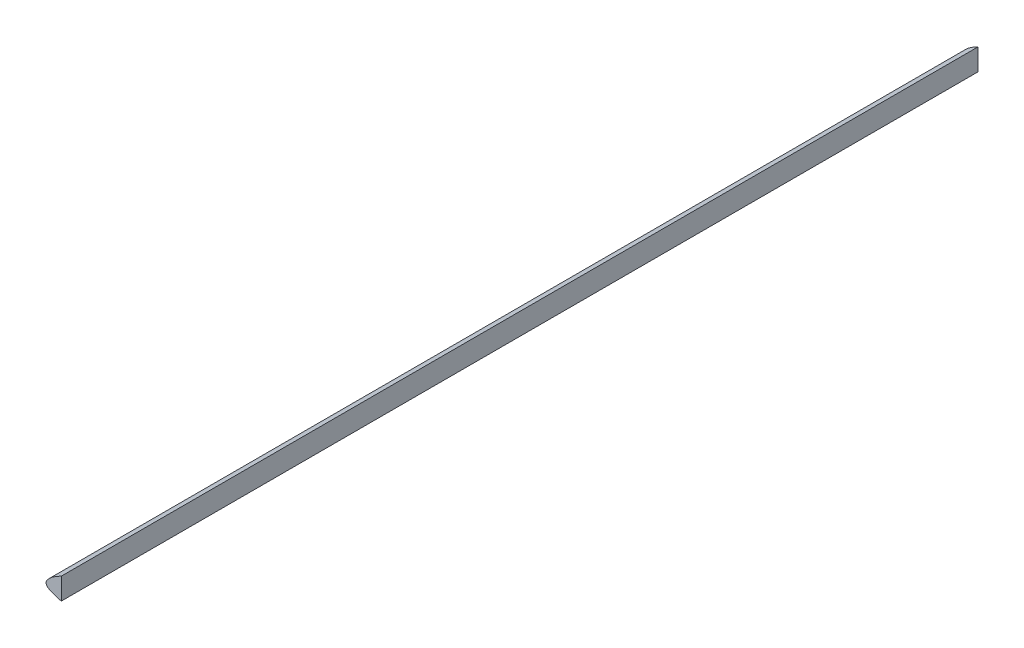
ISO-10303-21;
HEADER;
FILE_DESCRIPTION(('STEP AP214'),'2;1');
FILE_NAME('part.step','',(''),(''),'','','');
FILE_SCHEMA(('AUTOMOTIVE_DESIGN { 1 0 10303 214 1 1 1 1 }'));
ENDSEC;
DATA;
#1=APPLICATION_CONTEXT('core data for automotive mechanical design processes');
#2=APPLICATION_PROTOCOL_DEFINITION('international standard','automotive_design',2000,#1);
#3=PRODUCT_CONTEXT('',#1,'mechanical');
#4=PRODUCT('Part','Part','',(#3));
#5=PRODUCT_RELATED_PRODUCT_CATEGORY('part','',(#4));
#6=PRODUCT_DEFINITION_FORMATION('','',#4);
#7=PRODUCT_DEFINITION_CONTEXT('part definition',#1,'design');
#8=PRODUCT_DEFINITION('design','',#6,#7);
#9=PRODUCT_DEFINITION_SHAPE('','',#8);
#10=(LENGTH_UNIT() NAMED_UNIT(*) SI_UNIT(.MILLI.,.METRE.));
#11=(NAMED_UNIT(*) PLANE_ANGLE_UNIT() SI_UNIT($,.RADIAN.));
#12=(NAMED_UNIT(*) SI_UNIT($,.STERADIAN.) SOLID_ANGLE_UNIT());
#13=UNCERTAINTY_MEASURE_WITH_UNIT(LENGTH_MEASURE(1.E-05),#10,'distance_accuracy_value','');
#14=(GEOMETRIC_REPRESENTATION_CONTEXT(3) GLOBAL_UNCERTAINTY_ASSIGNED_CONTEXT((#13)) GLOBAL_UNIT_ASSIGNED_CONTEXT((#10,
#11,#12)) REPRESENTATION_CONTEXT('',''));
#15=CARTESIAN_POINT('',(0.,0.,0.));
#16=DIRECTION('',(0.,0.,1.));
#17=DIRECTION('',(1.,0.,0.));
#18=AXIS2_PLACEMENT_3D('',#15,#16,#17);
#19=CARTESIAN_POINT('',(1.15165455923713,2.60088125935629,-761.999746));
#20=DIRECTION('',(0.,0.,-1.));
#21=DIRECTION('',(-1.,0.,0.));
#22=AXIS2_PLACEMENT_3D('',#19,#20,#21);
#23=PLANE('',#22);
#24=DIRECTION('',(0.,-1.,0.));
#25=VECTOR('',#24,1.);
#26=CARTESIAN_POINT('',(12.7000000000001,0.,-761.999746));
#27=LINE('',#26,#25);
#28=CARTESIAN_POINT('',(12.7000000000001,11.1170877286177,-761.999746));
#29=VERTEX_POINT('',#28);
#30=CARTESIAN_POINT('',(12.7000000000001,-6.87603561469755,-761.999746));
#31=VERTEX_POINT('',#30);
#32=EDGE_CURVE('E62',#29,#31,#27,.T.);
#33=ORIENTED_EDGE('',*,*,#32,.T.);
#34=CARTESIAN_POINT('',(324.9026935512,0.,-761.999746));
#35=CARTESIAN_POINT('',(324.90346319559,0.0233133583806574,-761.999746));
#36=CARTESIAN_POINT('',(322.493960124611,0.266874853266928,-761.999746));
#37=CARTESIAN_POINT('',(320.107118726271,0.728898481684864,-761.999746));
#38=CARTESIAN_POINT('',(314.479929879271,1.69659954466814,-761.999746));
#39=CARTESIAN_POINT('',(307.761979309178,2.96651084650256,-761.999746));
#40=CARTESIAN_POINT('',(299.156213965818,4.44402058990994,-761.999746));
#41=CARTESIAN_POINT('',(289.108994082194,6.05458721176259,-761.999746));
#42=CARTESIAN_POINT('',(277.614504556848,7.85862541822672,-761.999746));
#43=CARTESIAN_POINT('',(264.867967681756,9.82863928319501,-761.999746));
#44=CARTESIAN_POINT('',(251.037893607433,11.9464568649147,-761.999746));
#45=CARTESIAN_POINT('',(236.320520328163,14.1628286822193,-761.999746));
#46=CARTESIAN_POINT('',(220.915494029042,16.4347978422618,-761.999746));
#47=CARTESIAN_POINT('',(205.033677241231,18.7162921045369,-761.999746));
#48=CARTESIAN_POINT('',(188.883341886899,20.9229885970704,-761.999746));
#49=CARTESIAN_POINT('',(172.682407247215,22.9973105242966,-761.999746));
#50=CARTESIAN_POINT('',(156.622614564687,24.8301784866328,-761.999746));
#51=CARTESIAN_POINT('',(140.85040765116,26.2625796247527,-761.999746));
#52=CARTESIAN_POINT('',(125.478771127742,27.2050458448488,-761.999746));
#53=CARTESIAN_POINT('',(110.596641231566,27.6094132257854,-761.999746));
#54=CARTESIAN_POINT('',(96.2853033385808,27.4446531652477,-761.999746));
#55=CARTESIAN_POINT('',(82.6164523566715,26.7221772489685,-761.999746));
#56=CARTESIAN_POINT('',(69.6684349637199,25.4642524848224,-761.999746));
#57=CARTESIAN_POINT('',(57.5288522663284,23.7890753252532,-761.999746));
#58=CARTESIAN_POINT('',(46.3056688527853,21.7557737945352,-761.999746));
#59=CARTESIAN_POINT('',(36.1124988210342,19.421560606896,-761.999746));
#60=CARTESIAN_POINT('',(27.0454876777921,16.8469786053261,-761.999746));
#61=CARTESIAN_POINT('',(19.1969550247217,14.0824194665185,-761.999746));
#62=CARTESIAN_POINT('',(12.6195182535387,11.1953401492948,-761.999746));
#63=CARTESIAN_POINT('',(7.39382924872228,8.27357700541017,-761.999746));
#64=CARTESIAN_POINT('',(3.46645559888262,5.36260960395899,-761.999746));
#65=CARTESIAN_POINT('',(1.0721441800177,2.69745028336921,-761.999746));
#66=CARTESIAN_POINT('',(-0.44301831227786,-0.0163803086251834,-761.999746));
#67=CARTESIAN_POINT('',(1.14212328936869,-2.66038157127671,-761.999746));
#68=CARTESIAN_POINT('',(4.36503605971503,-4.22676457114381,-761.999746));
#69=CARTESIAN_POINT('',(8.97122140423381,-6.02880941856467,-761.999746));
#70=CARTESIAN_POINT('',(15.243598773671,-7.49562746974023,-761.999746));
#71=CARTESIAN_POINT('',(23.0320560801708,-8.81343307785173,-761.999746));
#72=CARTESIAN_POINT('',(32.3248291039904,-9.88501521121111,-761.999746));
#73=CARTESIAN_POINT('',(43.02561085123,-10.7220049250572,-761.999746));
#74=CARTESIAN_POINT('',(55.0370190293927,-11.3213307402037,-761.999746));
#75=CARTESIAN_POINT('',(68.2344021608391,-11.6831205739109,-761.999746));
#76=CARTESIAN_POINT('',(82.4768909373014,-11.8216946355356,-761.999746));
#77=CARTESIAN_POINT('',(97.6058535702517,-11.7312635564645,-761.999746));
#78=CARTESIAN_POINT('',(113.468681032216,-11.4146303668036,-761.999746));
#79=CARTESIAN_POINT('',(129.930020512529,-10.7984705199419,-761.999746));
#80=CARTESIAN_POINT('',(146.859715046732,-9.93880113727659,-761.999746));
#81=CARTESIAN_POINT('',(164.102555427845,-8.95468862894909,-761.999746));
#82=CARTESIAN_POINT('',(181.455347717627,-7.91418790276717,-761.999746));
#83=CARTESIAN_POINT('',(198.694582838916,-6.86098310953203,-761.999746));
#84=CARTESIAN_POINT('',(215.596359860735,-5.83696040869958,-761.999746));
#85=CARTESIAN_POINT('',(231.942646986744,-4.86345762457903,-761.999746));
#86=CARTESIAN_POINT('',(247.517899408465,-3.96716262112094,-761.999746));
#87=CARTESIAN_POINT('',(262.118380872368,-3.15712058268027,-761.999746));
#88=CARTESIAN_POINT('',(275.542852028211,-2.44567542809517,-761.999746));
#89=CARTESIAN_POINT('',(287.622696903447,-1.83567813821833,-761.999746));
#90=CARTESIAN_POINT('',(298.158964312839,-1.30681197821665,-761.999746));
#91=CARTESIAN_POINT('',(307.165416690346,-0.826816663963498,-761.999746));
#92=CARTESIAN_POINT('',(314.173983408068,-0.368946974828929,-761.999746));
#93=CARTESIAN_POINT('',(319.999788969716,-0.117218531002151,-761.999746));
#94=CARTESIAN_POINT('',(322.456899939764,0.0391125120748008,-761.999746));
#95=CARTESIAN_POINT('',(324.901921434116,-0.0233882589368036,-761.999746));
#96=CARTESIAN_POINT('',(324.9026935512,0.,-761.999746));
#97=B_SPLINE_CURVE_WITH_KNOTS('',3,(#34,#35,#36,#37,#38,#39,#40,#41,#42,#43,#44,#45,#46,#47,#48,
#49,#50,#51,#52,#53,#54,#55,#56,#57,#58,#59,#60,#61,#62,#63,#64,#65,#66,#67,#68,#69,#70,#71,#72,
#73,#74,#75,#76,#77,#78,#79,#80,#81,#82,#83,#84,#85,#86,#87,#88,#89,#90,#91,#92,#93,#94,#95,
#96),.UNSPECIFIED.,.T.,.F.,(4,1,1,1,1,1,1,1,1,1,1,1,1,1,1,1,1,1,1,1,1,1,1,1,1,1,1,1,1,1,1,1,1,1,
1,1,1,1,1,1,1,1,1,1,1,1,1,1,1,1,1,1,1,1,1,1,1,1,1,1,4),(0.,0.00174808161666409,
0.00682736461152588,0.0148802194660928,0.0255723245187996,0.0386941569613535,0.0541707804092893,
0.0718340915004338,0.0914345327939838,0.112684613523076,0.135293128889252,0.158943981406575,
0.183314993013972,0.208069947428828,0.232879415911381,0.257398767385958,0.28138363259568,
0.304705763006072,0.32724149700788,0.348896563368039,0.369606939586334,0.389308375744097,
0.407885695760754,0.425177148613117,0.441026789913431,0.455299971521906,0.467903884546168,
0.478751648141021,0.487814349118281,0.495090030563699,0.500616983015744,0.504451368015862,
0.507803776366331,0.513091193317012,0.52054622904494,0.530249123140569,0.542213645081559,
0.556382479077403,0.572655501749116,0.590894528635496,0.610925387189739,0.632535858974259,
0.655496365431996,0.679547083246405,0.704498568619219,0.730211424578536,0.756435524546716,
0.782836661122501,0.809062449565475,0.834775916464845,0.859641281327499,0.883337826525987,
0.905540839068826,0.925965138816007,0.944326312756837,0.960365876879218,0.973929437555459,
0.984907697461011,0.993111340436855,0.998246302191831,1.),.UNSPECIFIED.);
#98=EDGE_CURVE('E11',#29,#31,#97,.T.);
#99=ORIENTED_EDGE('',*,*,#98,.F.);
#100=EDGE_LOOP('',(#33,#99));
#101=FACE_BOUND('',#100,.T.);
#102=ADVANCED_FACE('F33',(#101),#23,.T.);
#103=CARTESIAN_POINT('',(1.15165455923713,2.60088125935629,0.));
#104=DIRECTION('',(0.,0.,-1.));
#105=DIRECTION('',(-1.,0.,0.));
#106=AXIS2_PLACEMENT_3D('',#103,#104,#105);
#107=PLANE('',#106);
#108=CARTESIAN_POINT('',(324.9026935512,0.,0.));
#109=CARTESIAN_POINT('',(324.90346319559,0.0233133583806574,0.));
#110=CARTESIAN_POINT('',(322.493960124611,0.266874853266928,0.));
#111=CARTESIAN_POINT('',(320.107118726271,0.728898481684864,0.));
#112=CARTESIAN_POINT('',(314.479929879271,1.69659954466814,0.));
#113=CARTESIAN_POINT('',(307.761979309178,2.96651084650256,0.));
#114=CARTESIAN_POINT('',(299.156213965818,4.44402058990994,0.));
#115=CARTESIAN_POINT('',(289.108994082194,6.05458721176259,0.));
#116=CARTESIAN_POINT('',(277.614504556848,7.85862541822672,0.));
#117=CARTESIAN_POINT('',(264.867967681756,9.82863928319501,0.));
#118=CARTESIAN_POINT('',(251.037893607433,11.9464568649147,0.));
#119=CARTESIAN_POINT('',(236.320520328163,14.1628286822193,0.));
#120=CARTESIAN_POINT('',(220.915494029042,16.4347978422618,0.));
#121=CARTESIAN_POINT('',(205.033677241231,18.7162921045369,0.));
#122=CARTESIAN_POINT('',(188.883341886899,20.9229885970704,0.));
#123=CARTESIAN_POINT('',(172.682407247215,22.9973105242966,0.));
#124=CARTESIAN_POINT('',(156.622614564687,24.8301784866328,0.));
#125=CARTESIAN_POINT('',(140.85040765116,26.2625796247527,0.));
#126=CARTESIAN_POINT('',(125.478771127742,27.2050458448488,0.));
#127=CARTESIAN_POINT('',(110.596641231566,27.6094132257854,0.));
#128=CARTESIAN_POINT('',(96.2853033385808,27.4446531652477,0.));
#129=CARTESIAN_POINT('',(82.6164523566715,26.7221772489685,0.));
#130=CARTESIAN_POINT('',(69.6684349637199,25.4642524848224,0.));
#131=CARTESIAN_POINT('',(57.5288522663284,23.7890753252532,0.));
#132=CARTESIAN_POINT('',(46.3056688527853,21.7557737945352,0.));
#133=CARTESIAN_POINT('',(36.1124988210342,19.421560606896,0.));
#134=CARTESIAN_POINT('',(27.0454876777921,16.8469786053261,0.));
#135=CARTESIAN_POINT('',(19.1969550247217,14.0824194665185,0.));
#136=CARTESIAN_POINT('',(12.6195182535387,11.1953401492948,0.));
#137=CARTESIAN_POINT('',(7.39382924872228,8.27357700541017,0.));
#138=CARTESIAN_POINT('',(3.46645559888262,5.36260960395899,0.));
#139=CARTESIAN_POINT('',(1.0721441800177,2.69745028336921,0.));
#140=CARTESIAN_POINT('',(-0.44301831227786,-0.0163803086251834,0.));
#141=CARTESIAN_POINT('',(1.14212328936869,-2.66038157127671,0.));
#142=CARTESIAN_POINT('',(4.36503605971503,-4.22676457114381,0.));
#143=CARTESIAN_POINT('',(8.97122140423381,-6.02880941856467,0.));
#144=CARTESIAN_POINT('',(15.243598773671,-7.49562746974023,0.));
#145=CARTESIAN_POINT('',(23.0320560801708,-8.81343307785173,0.));
#146=CARTESIAN_POINT('',(32.3248291039904,-9.88501521121111,0.));
#147=CARTESIAN_POINT('',(43.02561085123,-10.7220049250572,0.));
#148=CARTESIAN_POINT('',(55.0370190293927,-11.3213307402037,0.));
#149=CARTESIAN_POINT('',(68.2344021608391,-11.6831205739109,0.));
#150=CARTESIAN_POINT('',(82.4768909373014,-11.8216946355356,0.));
#151=CARTESIAN_POINT('',(97.6058535702517,-11.7312635564645,0.));
#152=CARTESIAN_POINT('',(113.468681032216,-11.4146303668036,0.));
#153=CARTESIAN_POINT('',(129.930020512529,-10.7984705199419,0.));
#154=CARTESIAN_POINT('',(146.859715046732,-9.93880113727659,0.));
#155=CARTESIAN_POINT('',(164.102555427845,-8.95468862894909,0.));
#156=CARTESIAN_POINT('',(181.455347717627,-7.91418790276717,0.));
#157=CARTESIAN_POINT('',(198.694582838916,-6.86098310953203,0.));
#158=CARTESIAN_POINT('',(215.596359860735,-5.83696040869958,0.));
#159=CARTESIAN_POINT('',(231.942646986744,-4.86345762457903,0.));
#160=CARTESIAN_POINT('',(247.517899408465,-3.96716262112094,0.));
#161=CARTESIAN_POINT('',(262.118380872368,-3.15712058268027,0.));
#162=CARTESIAN_POINT('',(275.542852028211,-2.44567542809517,0.));
#163=CARTESIAN_POINT('',(287.622696903447,-1.83567813821833,0.));
#164=CARTESIAN_POINT('',(298.158964312839,-1.30681197821665,0.));
#165=CARTESIAN_POINT('',(307.165416690346,-0.826816663963498,0.));
#166=CARTESIAN_POINT('',(314.173983408068,-0.368946974828929,0.));
#167=CARTESIAN_POINT('',(319.999788969716,-0.117218531002151,0.));
#168=CARTESIAN_POINT('',(322.456899939764,0.0391125120748008,0.));
#169=CARTESIAN_POINT('',(324.901921434116,-0.0233882589368036,0.));
#170=CARTESIAN_POINT('',(324.9026935512,0.,0.));
#171=B_SPLINE_CURVE_WITH_KNOTS('',3,(#108,#109,#110,#111,#112,#113,#114,#115,#116,#117,#118,
#119,#120,#121,#122,#123,#124,#125,#126,#127,#128,#129,#130,#131,#132,#133,#134,#135,#136,#137,
#138,#139,#140,#141,#142,#143,#144,#145,#146,#147,#148,#149,#150,#151,#152,#153,#154,#155,#156,
#157,#158,#159,#160,#161,#162,#163,#164,#165,#166,#167,#168,#169,#170),.UNSPECIFIED.,.T.,.F.,(4,
1,1,1,1,1,1,1,1,1,1,1,1,1,1,1,1,1,1,1,1,1,1,1,1,1,1,1,1,1,1,1,1,1,1,1,1,1,1,1,1,1,1,1,1,1,1,1,1,
1,1,1,1,1,1,1,1,1,1,1,4),(0.,0.00174808161666409,0.00682736461152588,0.0148802194660928,
0.0255723245187996,0.0386941569613535,0.0541707804092893,0.0718340915004338,0.0914345327939838,
0.112684613523076,0.135293128889252,0.158943981406575,0.183314993013972,0.208069947428828,
0.232879415911381,0.257398767385958,0.28138363259568,0.304705763006072,0.32724149700788,
0.348896563368039,0.369606939586334,0.389308375744097,0.407885695760754,0.425177148613117,
0.441026789913431,0.455299971521906,0.467903884546168,0.478751648141021,0.487814349118281,
0.495090030563699,0.500616983015744,0.504451368015862,0.507803776366331,0.513091193317012,
0.52054622904494,0.530249123140569,0.542213645081559,0.556382479077403,0.572655501749116,
0.590894528635496,0.610925387189739,0.632535858974259,0.655496365431996,0.679547083246405,
0.704498568619219,0.730211424578536,0.756435524546716,0.782836661122501,0.809062449565475,
0.834775916464845,0.859641281327499,0.883337826525987,0.905540839068826,0.925965138816007,
0.944326312756837,0.960365876879218,0.973929437555459,0.984907697461011,0.993111340436855,
0.998246302191831,1.),.UNSPECIFIED.);
#172=CARTESIAN_POINT('',(12.7000000000001,11.1170877286177,0.));
#173=VERTEX_POINT('',#172);
#174=CARTESIAN_POINT('',(12.7000000000001,-6.87603561469755,0.));
#175=VERTEX_POINT('',#174);
#176=EDGE_CURVE('E43',#173,#175,#171,.T.);
#177=ORIENTED_EDGE('',*,*,#176,.T.);
#178=DIRECTION('',(0.,-1.,0.));
#179=VECTOR('',#178,1.);
#180=CARTESIAN_POINT('',(12.7000000000001,0.,0.));
#181=LINE('',#180,#179);
#182=EDGE_CURVE('E50',#173,#175,#181,.T.);
#183=ORIENTED_EDGE('',*,*,#182,.F.);
#184=EDGE_LOOP('',(#177,#183));
#185=FACE_BOUND('',#184,.T.);
#186=ADVANCED_FACE('F69',(#185),#107,.F.);
#187=CARTESIAN_POINT('',(324.9026935512,0.,-1090.34141295382));
#188=CARTESIAN_POINT('',(324.90346319559,0.0233133583806574,-1090.34141295382));
#189=CARTESIAN_POINT('',(322.493960124611,0.266874853266928,-1090.34141295382));
#190=CARTESIAN_POINT('',(320.107118726271,0.728898481684864,-1090.34141295382));
#191=CARTESIAN_POINT('',(314.479929879271,1.69659954466814,-1090.34141295382));
#192=CARTESIAN_POINT('',(307.761979309178,2.96651084650256,-1090.34141295382));
#193=CARTESIAN_POINT('',(299.156213965818,4.44402058990994,-1090.34141295382));
#194=CARTESIAN_POINT('',(289.108994082194,6.05458721176259,-1090.34141295382));
#195=CARTESIAN_POINT('',(277.614504556848,7.85862541822672,-1090.34141295382));
#196=CARTESIAN_POINT('',(264.867967681756,9.82863928319501,-1090.34141295382));
#197=CARTESIAN_POINT('',(251.037893607433,11.9464568649147,-1090.34141295382));
#198=CARTESIAN_POINT('',(236.320520328163,14.1628286822193,-1090.34141295382));
#199=CARTESIAN_POINT('',(220.915494029042,16.4347978422618,-1090.34141295382));
#200=CARTESIAN_POINT('',(205.033677241231,18.7162921045369,-1090.34141295382));
#201=CARTESIAN_POINT('',(188.883341886899,20.9229885970704,-1090.34141295382));
#202=CARTESIAN_POINT('',(172.682407247215,22.9973105242966,-1090.34141295382));
#203=CARTESIAN_POINT('',(156.622614564687,24.8301784866328,-1090.34141295382));
#204=CARTESIAN_POINT('',(140.85040765116,26.2625796247527,-1090.34141295382));
#205=CARTESIAN_POINT('',(125.478771127742,27.2050458448488,-1090.34141295382));
#206=CARTESIAN_POINT('',(110.596641231566,27.6094132257854,-1090.34141295382));
#207=CARTESIAN_POINT('',(96.2853033385808,27.4446531652477,-1090.34141295382));
#208=CARTESIAN_POINT('',(82.6164523566715,26.7221772489685,-1090.34141295382));
#209=CARTESIAN_POINT('',(69.6684349637199,25.4642524848224,-1090.34141295382));
#210=CARTESIAN_POINT('',(57.5288522663284,23.7890753252532,-1090.34141295382));
#211=CARTESIAN_POINT('',(46.3056688527853,21.7557737945352,-1090.34141295382));
#212=CARTESIAN_POINT('',(36.1124988210342,19.421560606896,-1090.34141295382));
#213=CARTESIAN_POINT('',(27.0454876777921,16.8469786053261,-1090.34141295382));
#214=CARTESIAN_POINT('',(19.1969550247217,14.0824194665185,-1090.34141295382));
#215=CARTESIAN_POINT('',(12.6195182535387,11.1953401492948,-1090.34141295382));
#216=CARTESIAN_POINT('',(7.39382924872228,8.27357700541017,-1090.34141295382));
#217=CARTESIAN_POINT('',(3.46645559888262,5.36260960395899,-1090.34141295382));
#218=CARTESIAN_POINT('',(1.0721441800177,2.69745028336921,-1090.34141295382));
#219=CARTESIAN_POINT('',(-0.44301831227786,-0.0163803086251834,-1090.34141295382));
#220=CARTESIAN_POINT('',(1.14212328936869,-2.66038157127671,-1090.34141295382));
#221=CARTESIAN_POINT('',(4.36503605971503,-4.22676457114381,-1090.34141295382));
#222=CARTESIAN_POINT('',(8.97122140423381,-6.02880941856467,-1090.34141295382));
#223=CARTESIAN_POINT('',(15.243598773671,-7.49562746974023,-1090.34141295382));
#224=CARTESIAN_POINT('',(23.0320560801708,-8.81343307785173,-1090.34141295382));
#225=CARTESIAN_POINT('',(32.3248291039904,-9.88501521121111,-1090.34141295382));
#226=CARTESIAN_POINT('',(43.02561085123,-10.7220049250572,-1090.34141295382));
#227=CARTESIAN_POINT('',(55.0370190293927,-11.3213307402037,-1090.34141295382));
#228=CARTESIAN_POINT('',(68.2344021608391,-11.6831205739109,-1090.34141295382));
#229=CARTESIAN_POINT('',(82.4768909373014,-11.8216946355356,-1090.34141295382));
#230=CARTESIAN_POINT('',(97.6058535702517,-11.7312635564645,-1090.34141295382));
#231=CARTESIAN_POINT('',(113.468681032216,-11.4146303668036,-1090.34141295382));
#232=CARTESIAN_POINT('',(129.930020512529,-10.7984705199419,-1090.34141295382));
#233=CARTESIAN_POINT('',(146.859715046732,-9.93880113727659,-1090.34141295382));
#234=CARTESIAN_POINT('',(164.102555427845,-8.95468862894909,-1090.34141295382));
#235=CARTESIAN_POINT('',(181.455347717627,-7.91418790276717,-1090.34141295382));
#236=CARTESIAN_POINT('',(198.694582838916,-6.86098310953203,-1090.34141295382));
#237=CARTESIAN_POINT('',(215.596359860735,-5.83696040869958,-1090.34141295382));
#238=CARTESIAN_POINT('',(231.942646986744,-4.86345762457903,-1090.34141295382));
#239=CARTESIAN_POINT('',(247.517899408465,-3.96716262112094,-1090.34141295382));
#240=CARTESIAN_POINT('',(262.118380872368,-3.15712058268027,-1090.34141295382));
#241=CARTESIAN_POINT('',(275.542852028211,-2.44567542809517,-1090.34141295382));
#242=CARTESIAN_POINT('',(287.622696903447,-1.83567813821833,-1090.34141295382));
#243=CARTESIAN_POINT('',(298.158964312839,-1.30681197821665,-1090.34141295382));
#244=CARTESIAN_POINT('',(307.165416690346,-0.826816663963498,-1090.34141295382));
#245=CARTESIAN_POINT('',(314.173983408068,-0.368946974828929,-1090.34141295382));
#246=CARTESIAN_POINT('',(319.999788969716,-0.117218531002151,-1090.34141295382));
#247=CARTESIAN_POINT('',(322.456899939764,0.0391125120748008,-1090.34141295382));
#248=CARTESIAN_POINT('',(324.901921434116,-0.0233882589368036,-1090.34141295382));
#249=CARTESIAN_POINT('',(324.9026935512,0.,-1090.34141295382));
#250=B_SPLINE_CURVE_WITH_KNOTS('',3,(#187,#188,#189,#190,#191,#192,#193,#194,#195,#196,#197,
#198,#199,#200,#201,#202,#203,#204,#205,#206,#207,#208,#209,#210,#211,#212,#213,#214,#215,#216,
#217,#218,#219,#220,#221,#222,#223,#224,#225,#226,#227,#228,#229,#230,#231,#232,#233,#234,#235,
#236,#237,#238,#239,#240,#241,#242,#243,#244,#245,#246,#247,#248,#249),.UNSPECIFIED.,.T.,.F.,(4,
1,1,1,1,1,1,1,1,1,1,1,1,1,1,1,1,1,1,1,1,1,1,1,1,1,1,1,1,1,1,1,1,1,1,1,1,1,1,1,1,1,1,1,1,1,1,1,1,
1,1,1,1,1,1,1,1,1,1,1,4),(0.,0.00174808161666409,0.00682736461152588,0.0148802194660928,
0.0255723245187996,0.0386941569613535,0.0541707804092893,0.0718340915004338,0.0914345327939838,
0.112684613523076,0.135293128889252,0.158943981406575,0.183314993013972,0.208069947428828,
0.232879415911381,0.257398767385958,0.28138363259568,0.304705763006072,0.32724149700788,
0.348896563368039,0.369606939586334,0.389308375744097,0.407885695760754,0.425177148613117,
0.441026789913431,0.455299971521906,0.467903884546168,0.478751648141021,0.487814349118281,
0.495090030563699,0.500616983015744,0.504451368015862,0.507803776366331,0.513091193317012,
0.52054622904494,0.530249123140569,0.542213645081559,0.556382479077403,0.572655501749116,
0.590894528635496,0.610925387189739,0.632535858974259,0.655496365431996,0.679547083246405,
0.704498568619219,0.730211424578536,0.756435524546716,0.782836661122501,0.809062449565475,
0.834775916464845,0.859641281327499,0.883337826525987,0.905540839068826,0.925965138816007,
0.944326312756837,0.960365876879218,0.973929437555459,0.984907697461011,0.993111340436855,
0.998246302191831,1.),.UNSPECIFIED.);
#251=DIRECTION('',(0.,0.,1.));
#252=VECTOR('',#251,1.);
#253=SURFACE_OF_LINEAR_EXTRUSION('',#250,#252);
#254=DIRECTION('',(0.,0.,1.));
#255=VECTOR('',#254,1.);
#256=CARTESIAN_POINT('',(12.7000000000001,11.1170877286177,-761.999746));
#257=LINE('',#256,#255);
#258=EDGE_CURVE('E60',#29,#173,#257,.T.);
#259=ORIENTED_EDGE('',*,*,#258,.F.);
#260=ORIENTED_EDGE('',*,*,#98,.T.);
#261=DIRECTION('',(0.,0.,1.));
#262=VECTOR('',#261,1.);
#263=CARTESIAN_POINT('',(12.7000000000001,-6.87603561469755,-761.999746));
#264=LINE('',#263,#262);
#265=EDGE_CURVE('E55',#31,#175,#264,.T.);
#266=ORIENTED_EDGE('',*,*,#265,.T.);
#267=ORIENTED_EDGE('',*,*,#176,.F.);
#268=EDGE_LOOP('',(#259,#260,#266,#267));
#269=FACE_BOUND('',#268,.T.);
#270=ADVANCED_FACE('F71',(#269),#253,.T.);
#271=CARTESIAN_POINT('',(12.7000000000001,0.,-761.999746));
#272=DIRECTION('',(-1.,0.,0.));
#273=DIRECTION('',(0.,-1.,0.));
#274=AXIS2_PLACEMENT_3D('',#271,#272,#273);
#275=PLANE('',#274);
#276=ORIENTED_EDGE('',*,*,#182,.T.);
#277=ORIENTED_EDGE('',*,*,#265,.F.);
#278=ORIENTED_EDGE('',*,*,#32,.F.);
#279=ORIENTED_EDGE('',*,*,#258,.T.);
#280=EDGE_LOOP('',(#276,#277,#278,#279));
#281=FACE_BOUND('',#280,.T.);
#282=ADVANCED_FACE('F61',(#281),#275,.F.);
#283=CLOSED_SHELL('',(#102,#186,#270,#282));
#284=MANIFOLD_SOLID_BREP('B2',#283);
#285=ADVANCED_BREP_SHAPE_REPRESENTATION('',(#18,#284),#14);
#286=SHAPE_DEFINITION_REPRESENTATION(#9,#285);
ENDSEC;
END-ISO-10303-21;
